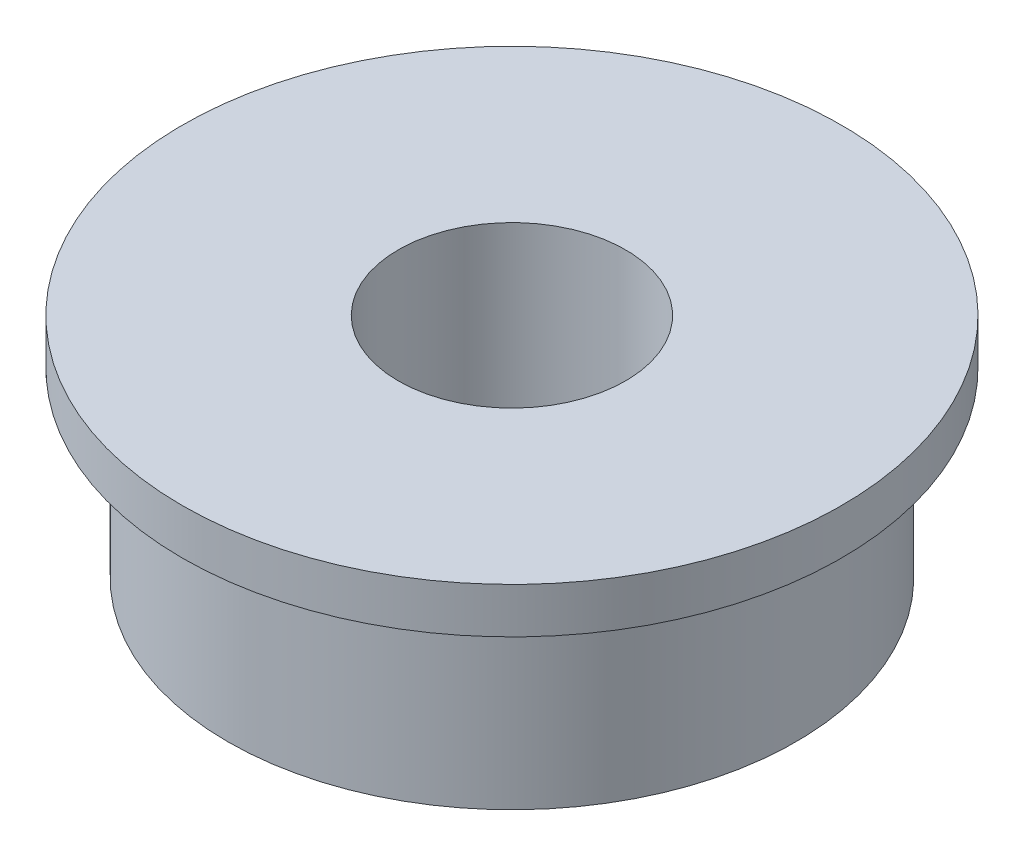
ISO-10303-21;
HEADER;
FILE_DESCRIPTION(('STEP AP214'),'2;1');
FILE_NAME('part.step','',(''),(''),'','','');
FILE_SCHEMA(('AUTOMOTIVE_DESIGN { 1 0 10303 214 1 1 1 1 }'));
ENDSEC;
DATA;
#1=APPLICATION_CONTEXT('core data for automotive mechanical design processes');
#2=APPLICATION_PROTOCOL_DEFINITION('international standard','automotive_design',2000,#1);
#3=PRODUCT_CONTEXT('',#1,'mechanical');
#4=PRODUCT('Part','Part','',(#3));
#5=PRODUCT_RELATED_PRODUCT_CATEGORY('part','',(#4));
#6=PRODUCT_DEFINITION_FORMATION('','',#4);
#7=PRODUCT_DEFINITION_CONTEXT('part definition',#1,'design');
#8=PRODUCT_DEFINITION('design','',#6,#7);
#9=PRODUCT_DEFINITION_SHAPE('','',#8);
#10=(LENGTH_UNIT() NAMED_UNIT(*) SI_UNIT(.MILLI.,.METRE.));
#11=(NAMED_UNIT(*) PLANE_ANGLE_UNIT() SI_UNIT($,.RADIAN.));
#12=(NAMED_UNIT(*) SI_UNIT($,.STERADIAN.) SOLID_ANGLE_UNIT());
#13=UNCERTAINTY_MEASURE_WITH_UNIT(LENGTH_MEASURE(1.E-05),#10,'distance_accuracy_value','');
#14=(GEOMETRIC_REPRESENTATION_CONTEXT(3) GLOBAL_UNCERTAINTY_ASSIGNED_CONTEXT((#13)) GLOBAL_UNIT_ASSIGNED_CONTEXT((#10,
#11,#12)) REPRESENTATION_CONTEXT('',''));
#15=CARTESIAN_POINT('',(0.,0.,0.));
#16=DIRECTION('',(0.,0.,1.));
#17=DIRECTION('',(1.,0.,0.));
#18=AXIS2_PLACEMENT_3D('',#15,#16,#17);
#19=CARTESIAN_POINT('',(0.,0.,0.));
#20=DIRECTION('',(0.,1.,0.));
#21=DIRECTION('',(0.,0.,1.));
#22=AXIS2_PLACEMENT_3D('',#19,#20,#21);
#23=PLANE('',#22);
#24=CARTESIAN_POINT('',(0.,0.,0.));
#25=DIRECTION('',(0.,1.,0.));
#26=DIRECTION('',(0.,0.,1.));
#27=AXIS2_PLACEMENT_3D('',#24,#25,#26);
#28=CIRCLE('',#27,5.);
#29=CARTESIAN_POINT('',(0.,0.,5.));
#30=VERTEX_POINT('',#29);
#31=EDGE_CURVE('E43',#30,#30,#28,.T.);
#32=ORIENTED_EDGE('',*,*,#31,.F.);
#33=EDGE_LOOP('',(#32));
#34=FACE_BOUND('',#33,.T.);
#35=CARTESIAN_POINT('',(0.,0.,0.));
#36=DIRECTION('',(0.,1.,0.));
#37=DIRECTION('',(0.,0.,1.));
#38=AXIS2_PLACEMENT_3D('',#35,#36,#37);
#39=CIRCLE('',#38,2.);
#40=CARTESIAN_POINT('',(0.,0.,2.));
#41=VERTEX_POINT('',#40);
#42=EDGE_CURVE('E50',#41,#41,#39,.T.);
#43=ORIENTED_EDGE('',*,*,#42,.T.);
#44=EDGE_LOOP('',(#43));
#45=FACE_BOUND('',#44,.T.);
#46=ADVANCED_FACE('F39',(#34,#45),#23,.F.);
#47=CARTESIAN_POINT('',(0.,3.2,0.));
#48=DIRECTION('',(0.,-1.,0.));
#49=DIRECTION('',(0.,0.,-1.));
#50=AXIS2_PLACEMENT_3D('',#47,#48,#49);
#51=CYLINDRICAL_SURFACE('',#50,5.);
#52=CARTESIAN_POINT('',(0.,3.2,0.));
#53=DIRECTION('',(0.,1.,0.));
#54=DIRECTION('',(0.,0.,1.));
#55=AXIS2_PLACEMENT_3D('',#52,#53,#54);
#56=CIRCLE('',#55,5.);
#57=CARTESIAN_POINT('',(0.,3.2,5.));
#58=VERTEX_POINT('',#57);
#59=EDGE_CURVE('E10',#58,#58,#56,.T.);
#60=ORIENTED_EDGE('',*,*,#59,.F.);
#61=EDGE_LOOP('',(#60));
#62=FACE_BOUND('',#61,.T.);
#63=ORIENTED_EDGE('',*,*,#31,.T.);
#64=EDGE_LOOP('',(#63));
#65=FACE_BOUND('',#64,.T.);
#66=ADVANCED_FACE('F41',(#62,#65),#51,.T.);
#67=CARTESIAN_POINT('',(0.,3.2,0.));
#68=DIRECTION('',(0.,-1.,0.));
#69=DIRECTION('',(0.,0.,-1.));
#70=AXIS2_PLACEMENT_3D('',#67,#68,#69);
#71=CYLINDRICAL_SURFACE('',#70,2.);
#72=ORIENTED_EDGE('',*,*,#42,.F.);
#73=EDGE_LOOP('',(#72));
#74=FACE_BOUND('',#73,.T.);
#75=CARTESIAN_POINT('',(0.,4.,0.));
#76=DIRECTION('',(0.,1.,0.));
#77=DIRECTION('',(0.,0.,1.));
#78=AXIS2_PLACEMENT_3D('',#75,#76,#77);
#79=CIRCLE('',#78,2.);
#80=CARTESIAN_POINT('',(0.,4.,2.));
#81=VERTEX_POINT('',#80);
#82=EDGE_CURVE('E58',#81,#81,#79,.T.);
#83=ORIENTED_EDGE('',*,*,#82,.T.);
#84=EDGE_LOOP('',(#83));
#85=FACE_BOUND('',#84,.T.);
#86=ADVANCED_FACE('F64',(#74,#85),#71,.F.);
#87=CARTESIAN_POINT('',(0.,4.,0.));
#88=DIRECTION('',(0.,1.,0.));
#89=DIRECTION('',(0.,0.,1.));
#90=AXIS2_PLACEMENT_3D('',#87,#88,#89);
#91=PLANE('',#90);
#92=CARTESIAN_POINT('',(0.,4.,0.));
#93=DIRECTION('',(0.,1.,0.));
#94=DIRECTION('',(0.,0.,1.));
#95=AXIS2_PLACEMENT_3D('',#92,#93,#94);
#96=CIRCLE('',#95,5.8);
#97=CARTESIAN_POINT('',(0.,4.,5.8));
#98=VERTEX_POINT('',#97);
#99=EDGE_CURVE('E54',#98,#98,#96,.T.);
#100=ORIENTED_EDGE('',*,*,#99,.T.);
#101=EDGE_LOOP('',(#100));
#102=FACE_BOUND('',#101,.T.);
#103=ORIENTED_EDGE('',*,*,#82,.F.);
#104=EDGE_LOOP('',(#103));
#105=FACE_BOUND('',#104,.T.);
#106=ADVANCED_FACE('F66',(#102,#105),#91,.T.);
#107=CARTESIAN_POINT('',(0.,3.2,0.));
#108=DIRECTION('',(0.,1.,0.));
#109=DIRECTION('',(0.,0.,1.));
#110=AXIS2_PLACEMENT_3D('',#107,#108,#109);
#111=PLANE('',#110);
#112=ORIENTED_EDGE('',*,*,#59,.T.);
#113=EDGE_LOOP('',(#112));
#114=FACE_BOUND('',#113,.T.);
#115=CARTESIAN_POINT('',(0.,3.2,0.));
#116=DIRECTION('',(0.,1.,0.));
#117=DIRECTION('',(0.,0.,1.));
#118=AXIS2_PLACEMENT_3D('',#115,#116,#117);
#119=CIRCLE('',#118,5.8);
#120=CARTESIAN_POINT('',(0.,3.2,5.8));
#121=VERTEX_POINT('',#120);
#122=EDGE_CURVE('E55',#121,#121,#119,.T.);
#123=ORIENTED_EDGE('',*,*,#122,.F.);
#124=EDGE_LOOP('',(#123));
#125=FACE_BOUND('',#124,.T.);
#126=ADVANCED_FACE('F68',(#114,#125),#111,.F.);
#127=CARTESIAN_POINT('',(0.,4.,0.));
#128=DIRECTION('',(0.,-1.,0.));
#129=DIRECTION('',(0.,0.,-1.));
#130=AXIS2_PLACEMENT_3D('',#127,#128,#129);
#131=CYLINDRICAL_SURFACE('',#130,5.8);
#132=ORIENTED_EDGE('',*,*,#99,.F.);
#133=EDGE_LOOP('',(#132));
#134=FACE_BOUND('',#133,.T.);
#135=ORIENTED_EDGE('',*,*,#122,.T.);
#136=EDGE_LOOP('',(#135));
#137=FACE_BOUND('',#136,.T.);
#138=ADVANCED_FACE('F75',(#134,#137),#131,.T.);
#139=CLOSED_SHELL('',(#46,#66,#86,#106,#126,#138));
#140=MANIFOLD_SOLID_BREP('B2',#139);
#141=ADVANCED_BREP_SHAPE_REPRESENTATION('',(#18,#140),#14);
#142=SHAPE_DEFINITION_REPRESENTATION(#9,#141);
ENDSEC;
END-ISO-10303-21;
